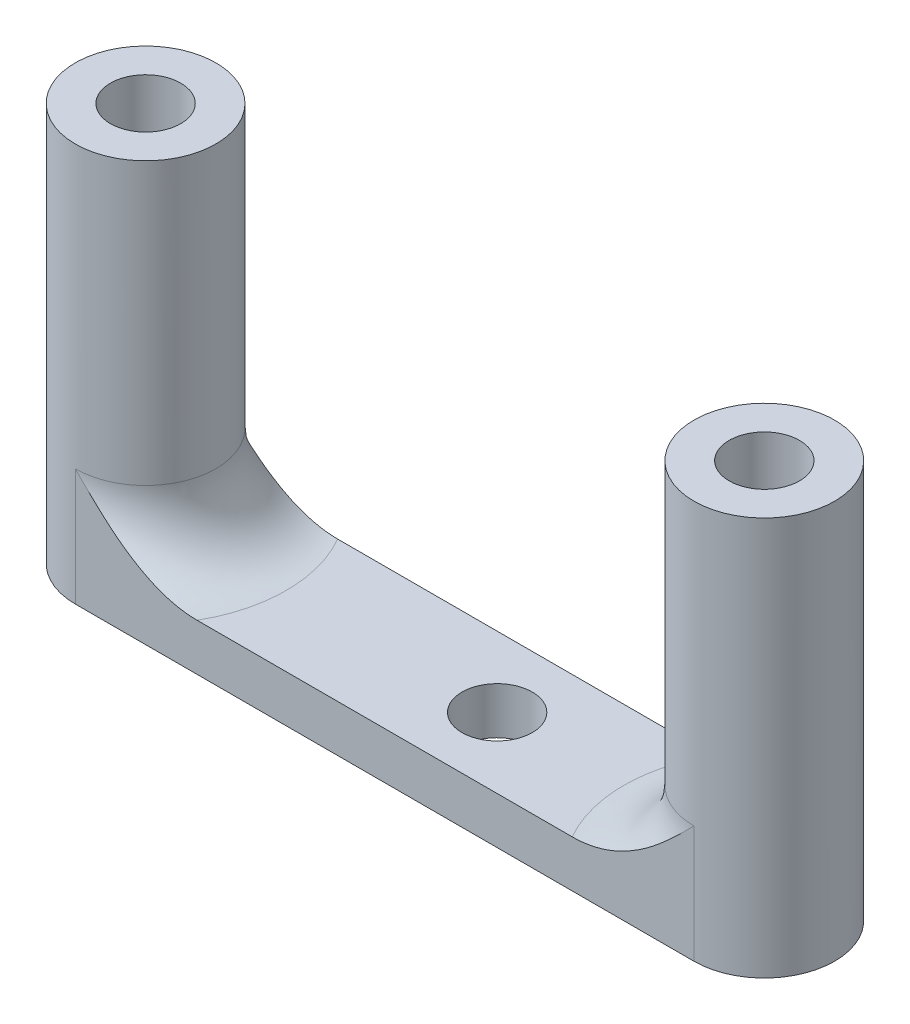
ISO-10303-21;
HEADER;
FILE_DESCRIPTION(('STEP AP214'),'2;1');
FILE_NAME('part.step','',(''),(''),'','','');
FILE_SCHEMA(('AUTOMOTIVE_DESIGN { 1 0 10303 214 1 1 1 1 }'));
ENDSEC;
DATA;
#1=APPLICATION_CONTEXT('core data for automotive mechanical design processes');
#2=APPLICATION_PROTOCOL_DEFINITION('international standard','automotive_design',2000,#1);
#3=PRODUCT_CONTEXT('',#1,'mechanical');
#4=PRODUCT('Part','Part','',(#3));
#5=PRODUCT_RELATED_PRODUCT_CATEGORY('part','',(#4));
#6=PRODUCT_DEFINITION_FORMATION('','',#4);
#7=PRODUCT_DEFINITION_CONTEXT('part definition',#1,'design');
#8=PRODUCT_DEFINITION('design','',#6,#7);
#9=PRODUCT_DEFINITION_SHAPE('','',#8);
#10=(LENGTH_UNIT() NAMED_UNIT(*) SI_UNIT(.MILLI.,.METRE.));
#11=(NAMED_UNIT(*) PLANE_ANGLE_UNIT() SI_UNIT($,.RADIAN.));
#12=(NAMED_UNIT(*) SI_UNIT($,.STERADIAN.) SOLID_ANGLE_UNIT());
#13=UNCERTAINTY_MEASURE_WITH_UNIT(LENGTH_MEASURE(1.E-05),#10,'distance_accuracy_value','');
#14=(GEOMETRIC_REPRESENTATION_CONTEXT(3) GLOBAL_UNCERTAINTY_ASSIGNED_CONTEXT((#13)) GLOBAL_UNIT_ASSIGNED_CONTEXT((#10,
#11,#12)) REPRESENTATION_CONTEXT('',''));
#15=CARTESIAN_POINT('',(0.,0.,0.));
#16=DIRECTION('',(0.,0.,1.));
#17=DIRECTION('',(1.,0.,0.));
#18=AXIS2_PLACEMENT_3D('',#15,#16,#17);
#19=CARTESIAN_POINT('',(0.,2.,0.));
#20=DIRECTION('',(0.,1.,0.));
#21=DIRECTION('',(0.,0.,1.));
#22=AXIS2_PLACEMENT_3D('',#19,#20,#21);
#23=PLANE('',#22);
#24=CARTESIAN_POINT('',(15.,2.,0.));
#25=DIRECTION('',(0.,1.,0.));
#26=DIRECTION('',(0.,0.,1.));
#27=AXIS2_PLACEMENT_3D('',#24,#25,#26);
#28=CIRCLE('',#27,1.5);
#29=CARTESIAN_POINT('',(15.,2.,1.5));
#30=VERTEX_POINT('',#29);
#31=EDGE_CURVE('E138',#30,#30,#28,.T.);
#32=ORIENTED_EDGE('',*,*,#31,.F.);
#33=EDGE_LOOP('',(#32));
#34=FACE_BOUND('',#33,.T.);
#35=DIRECTION('',(1.,0.,0.));
#36=VECTOR('',#35,1.);
#37=CARTESIAN_POINT('',(0.,2.,3.));
#38=LINE('',#37,#36);
#39=CARTESIAN_POINT('',(5.19615242270663,2.,3.));
#40=VERTEX_POINT('',#39);
#41=CARTESIAN_POINT('',(21.2038475772934,2.,3.));
#42=VERTEX_POINT('',#41);
#43=EDGE_CURVE('E193',#40,#42,#38,.T.);
#44=ORIENTED_EDGE('',*,*,#43,.T.);
#45=CARTESIAN_POINT('',(26.4,2.,0.));
#46=DIRECTION('',(0.,1.,0.));
#47=DIRECTION('',(0.,0.,1.));
#48=AXIS2_PLACEMENT_3D('',#45,#46,#47);
#49=CIRCLE('',#48,6.);
#50=CARTESIAN_POINT('',(21.2038475772934,2.,-3.));
#51=VERTEX_POINT('',#50);
#52=EDGE_CURVE('E148',#42,#51,#49,.F.);
#53=ORIENTED_EDGE('',*,*,#52,.T.);
#54=DIRECTION('',(1.,0.,0.));
#55=VECTOR('',#54,1.);
#56=CARTESIAN_POINT('',(0.,2.,-3.));
#57=LINE('',#56,#55);
#58=CARTESIAN_POINT('',(5.19615242270663,2.,-3.));
#59=VERTEX_POINT('',#58);
#60=EDGE_CURVE('E141',#59,#51,#57,.T.);
#61=ORIENTED_EDGE('',*,*,#60,.F.);
#62=CARTESIAN_POINT('',(0.,2.,0.));
#63=DIRECTION('',(0.,1.,0.));
#64=DIRECTION('',(0.,0.,1.));
#65=AXIS2_PLACEMENT_3D('',#62,#63,#64);
#66=CIRCLE('',#65,6.);
#67=EDGE_CURVE('E120',#59,#40,#66,.F.);
#68=ORIENTED_EDGE('',*,*,#67,.T.);
#69=EDGE_LOOP('',(#44,#53,#61,#68));
#70=FACE_BOUND('',#69,.T.);
#71=ADVANCED_FACE('F40',(#34,#70),#23,.T.);
#72=CARTESIAN_POINT('',(0.,2.,3.));
#73=DIRECTION('',(0.,0.,-1.));
#74=DIRECTION('',(-1.,0.,0.));
#75=AXIS2_PLACEMENT_3D('',#72,#73,#74);
#76=PLANE('',#75);
#77=DIRECTION('',(1.,0.,0.));
#78=VECTOR('',#77,1.);
#79=CARTESIAN_POINT('',(0.,0.,3.));
#80=LINE('',#79,#78);
#81=CARTESIAN_POINT('',(0.,0.,3.));
#82=VERTEX_POINT('',#81);
#83=CARTESIAN_POINT('',(26.4,0.,3.));
#84=VERTEX_POINT('',#83);
#85=EDGE_CURVE('E106',#82,#84,#80,.T.);
#86=ORIENTED_EDGE('',*,*,#85,.T.);
#87=DIRECTION('',(0.,-1.,0.));
#88=VECTOR('',#87,1.);
#89=CARTESIAN_POINT('',(26.4,2.,3.));
#90=LINE('',#89,#88);
#91=CARTESIAN_POINT('',(26.4,5.,3.));
#92=VERTEX_POINT('',#91);
#93=EDGE_CURVE('E112',#92,#84,#90,.T.);
#94=ORIENTED_EDGE('',*,*,#93,.F.);
#95=CARTESIAN_POINT('',(21.2038475772934,2.,3.));
#96=CARTESIAN_POINT('',(21.3323905402401,1.99998218210298,3.));
#97=CARTESIAN_POINT('',(21.4608584367806,2.00619338983788,3.));
#98=CARTESIAN_POINT('',(21.7165185660793,2.03022062258355,3.));
#99=CARTESIAN_POINT('',(21.8437124415279,2.04801898743739,3.));
#100=CARTESIAN_POINT('',(22.0945753557731,2.09409313995617,3.));
#101=CARTESIAN_POINT('',(22.2182683985294,2.12224012477032,3.));
#102=CARTESIAN_POINT('',(22.4631017314671,2.18815840703016,3.));
#103=CARTESIAN_POINT('',(22.5842407722222,2.22593430187453,3.));
#104=CARTESIAN_POINT('',(22.8679415812324,2.32588423317901,3.));
#105=CARTESIAN_POINT('',(23.0291515588678,2.39190700124902,3.));
#106=CARTESIAN_POINT('',(23.3450406847037,2.53801190440803,3.));
#107=CARTESIAN_POINT('',(23.4997178359521,2.61809830042489,3.));
#108=CARTESIAN_POINT('',(23.803053314862,2.79045446430362,3.));
#109=CARTESIAN_POINT('',(23.9516793768285,2.88278058033993,3.));
#110=CARTESIAN_POINT('',(24.242452962768,3.07718753602969,3.));
#111=CARTESIAN_POINT('',(24.384597481119,3.17927283461535,3.));
#112=CARTESIAN_POINT('',(24.8597710470216,3.54097570405611,3.));
#113=CARTESIAN_POINT('',(25.1784881477469,3.81922286040245,3.));
#114=CARTESIAN_POINT('',(25.7955632435218,4.39571188094858,3.));
#115=CARTESIAN_POINT('',(26.0939368225871,4.69393808507017,2.99999999999998));
#116=CARTESIAN_POINT('',(26.3948360200621,4.994836021821,3.));
#117=CARTESIAN_POINT('',(26.3974180089046,4.99741801079189,3.));
#118=CARTESIAN_POINT('',(26.4,5.,3.));
#119=B_SPLINE_CURVE_WITH_KNOTS('',3,(#95,#96,#97,#98,#99,#100,#101,#102,#103,#104,#105,#106,
#107,#108,#109,#110,#111,#112,#113,#114,#115,#116,#117,#118),.UNSPECIFIED.,.F.,.F.,(4,2,2,2,2,2,
2,2,2,2,2,4),(0.,0.385368958218872,0.770151940642411,1.15029950394383,1.53062891278464,
2.05242008909191,2.57436962870345,3.09881141308673,3.62349396860826,4.89012609564403,
6.15577676525226,6.16673121643429),.UNSPECIFIED.);
#120=EDGE_CURVE('E166',#92,#42,#119,.F.);
#121=ORIENTED_EDGE('',*,*,#120,.T.);
#122=ORIENTED_EDGE('',*,*,#43,.F.);
#123=CARTESIAN_POINT('',(5.19615242270663,2.,3.));
#124=CARTESIAN_POINT('',(5.06760945976004,1.99998218210298,3.));
#125=CARTESIAN_POINT('',(4.93914156321971,2.00619338983787,3.));
#126=CARTESIAN_POINT('',(4.68348143392134,2.03022062258348,3.));
#127=CARTESIAN_POINT('',(4.55628755847284,2.04801898743727,3.));
#128=CARTESIAN_POINT('',(4.30542464422772,2.094093139956,3.));
#129=CARTESIAN_POINT('',(4.18173160147121,2.12224012477016,3.));
#130=CARTESIAN_POINT('',(3.93689826853325,2.18815840703006,3.));
#131=CARTESIAN_POINT('',(3.81575922777798,2.22593430187448,3.));
#132=CARTESIAN_POINT('',(3.53205841876747,2.32588423317906,3.));
#133=CARTESIAN_POINT('',(3.3708484411319,2.39190700124911,3.));
#134=CARTESIAN_POINT('',(3.0549593152958,2.53801190440826,3.));
#135=CARTESIAN_POINT('',(2.90028216404738,2.6180983004252,3.));
#136=CARTESIAN_POINT('',(2.59694668513745,2.79045446430392,3.));
#137=CARTESIAN_POINT('',(2.44832062317112,2.88278058034013,3.));
#138=CARTESIAN_POINT('',(2.15754703723191,3.07718753602986,3.));
#139=CARTESIAN_POINT('',(2.01540251888108,3.17927283461558,3.));
#140=CARTESIAN_POINT('',(1.54022895297817,3.54097570405566,3.));
#141=CARTESIAN_POINT('',(1.22151185225098,3.81922286039994,3.));
#142=CARTESIAN_POINT('',(0.60443675648067,4.39571188095075,3.));
#143=CARTESIAN_POINT('',(0.306063177421879,4.69393808507906,3.));
#144=CARTESIAN_POINT('',(0.00516397993798114,4.99483602182119,3.));
#145=CARTESIAN_POINT('',(0.00258199109543038,4.99741801079198,3.));
#146=CARTESIAN_POINT('',(0.,5.,3.));
#147=B_SPLINE_CURVE_WITH_KNOTS('',3,(#123,#124,#125,#126,#127,#128,#129,#130,#131,#132,#133,
#134,#135,#136,#137,#138,#139,#140,#141,#142,#143,#144,#145,#146),.UNSPECIFIED.,.F.,.F.,(4,2,2,
2,2,2,2,2,2,2,2,4),(0.,0.385368958218407,0.770151940641463,1.15029950394335,1.53062891278463,
2.0524200890923,2.5743696287042,3.09881141308705,3.62349396860826,4.89012609564365,
6.15577676525232,6.16673121643428),.UNSPECIFIED.);
#148=CARTESIAN_POINT('',(0.,5.,3.));
#149=VERTEX_POINT('',#148);
#150=EDGE_CURVE('E11',#40,#149,#147,.T.);
#151=ORIENTED_EDGE('',*,*,#150,.T.);
#152=DIRECTION('',(0.,-1.,0.));
#153=VECTOR('',#152,1.);
#154=CARTESIAN_POINT('',(0.,2.,3.));
#155=LINE('',#154,#153);
#156=EDGE_CURVE('E70',#149,#82,#155,.T.);
#157=ORIENTED_EDGE('',*,*,#156,.T.);
#158=EDGE_LOOP('',(#86,#94,#121,#122,#151,#157));
#159=FACE_BOUND('',#158,.T.);
#160=ADVANCED_FACE('F123',(#159),#76,.F.);
#161=CARTESIAN_POINT('',(26.4,2.,0.));
#162=DIRECTION('',(0.,-1.,0.));
#163=DIRECTION('',(0.,0.,-1.));
#164=AXIS2_PLACEMENT_3D('',#161,#162,#163);
#165=CYLINDRICAL_SURFACE('',#164,3.);
#166=DIRECTION('',(0.,-1.,0.));
#167=VECTOR('',#166,1.);
#168=CARTESIAN_POINT('',(26.4,2.,-3.));
#169=LINE('',#168,#167);
#170=CARTESIAN_POINT('',(26.4,5.,-3.));
#171=VERTEX_POINT('',#170);
#172=CARTESIAN_POINT('',(26.4,0.,-3.));
#173=VERTEX_POINT('',#172);
#174=EDGE_CURVE('E121',#171,#173,#169,.T.);
#175=ORIENTED_EDGE('',*,*,#174,.F.);
#176=CARTESIAN_POINT('',(26.4,5.,0.));
#177=DIRECTION('',(0.,1.,0.));
#178=DIRECTION('',(0.,0.,1.));
#179=AXIS2_PLACEMENT_3D('',#176,#177,#178);
#180=CIRCLE('',#179,3.);
#181=EDGE_CURVE('E116',#171,#92,#180,.T.);
#182=ORIENTED_EDGE('',*,*,#181,.T.);
#183=ORIENTED_EDGE('',*,*,#93,.T.);
#184=CARTESIAN_POINT('',(26.4,0.,0.));
#185=DIRECTION('',(0.,1.,0.));
#186=DIRECTION('',(0.,0.,1.));
#187=AXIS2_PLACEMENT_3D('',#184,#185,#186);
#188=CIRCLE('',#187,3.);
#189=EDGE_CURVE('E101',#84,#173,#188,.T.);
#190=ORIENTED_EDGE('',*,*,#189,.T.);
#191=EDGE_LOOP('',(#175,#182,#183,#190));
#192=FACE_BOUND('',#191,.T.);
#193=CARTESIAN_POINT('',(26.4,17.,0.));
#194=DIRECTION('',(0.,1.,0.));
#195=DIRECTION('',(0.,0.,1.));
#196=AXIS2_PLACEMENT_3D('',#193,#194,#195);
#197=CIRCLE('',#196,3.);
#198=CARTESIAN_POINT('',(26.4,17.,3.));
#199=VERTEX_POINT('',#198);
#200=EDGE_CURVE('E253',#199,#199,#197,.T.);
#201=ORIENTED_EDGE('',*,*,#200,.F.);
#202=EDGE_LOOP('',(#201));
#203=FACE_BOUND('',#202,.T.);
#204=ADVANCED_FACE('F113',(#192,#203),#165,.T.);
#205=CARTESIAN_POINT('',(0.,2.,-3.));
#206=DIRECTION('',(0.,0.,-1.));
#207=DIRECTION('',(-1.,0.,0.));
#208=AXIS2_PLACEMENT_3D('',#205,#206,#207);
#209=PLANE('',#208);
#210=DIRECTION('',(1.,0.,0.));
#211=VECTOR('',#210,1.);
#212=CARTESIAN_POINT('',(0.,0.,-3.));
#213=LINE('',#212,#211);
#214=CARTESIAN_POINT('',(0.,0.,-3.));
#215=VERTEX_POINT('',#214);
#216=EDGE_CURVE('E107',#215,#173,#213,.T.);
#217=ORIENTED_EDGE('',*,*,#216,.F.);
#218=DIRECTION('',(0.,-1.,0.));
#219=VECTOR('',#218,1.);
#220=CARTESIAN_POINT('',(0.,2.,-3.));
#221=LINE('',#220,#219);
#222=CARTESIAN_POINT('',(0.,5.,-3.));
#223=VERTEX_POINT('',#222);
#224=EDGE_CURVE('E62',#223,#215,#221,.T.);
#225=ORIENTED_EDGE('',*,*,#224,.F.);
#226=CARTESIAN_POINT('',(5.19615242270663,2.,-3.));
#227=CARTESIAN_POINT('',(5.06760945976004,1.99998218210298,-3.));
#228=CARTESIAN_POINT('',(4.93914156321971,2.00619338983787,-3.));
#229=CARTESIAN_POINT('',(4.68348143392133,2.03022062258348,-3.));
#230=CARTESIAN_POINT('',(4.55628755847283,2.04801898743727,-3.));
#231=CARTESIAN_POINT('',(4.30542464422772,2.094093139956,-3.));
#232=CARTESIAN_POINT('',(4.18173160147121,2.12224012477017,-3.));
#233=CARTESIAN_POINT('',(3.93689826853324,2.18815840703006,-3.));
#234=CARTESIAN_POINT('',(3.81575922777798,2.22593430187448,-3.));
#235=CARTESIAN_POINT('',(3.53205841876747,2.32588423317906,-3.));
#236=CARTESIAN_POINT('',(3.3708484411319,2.39190700124911,-3.));
#237=CARTESIAN_POINT('',(3.0549593152958,2.53801190440826,-3.));
#238=CARTESIAN_POINT('',(2.90028216404738,2.61809830042519,-3.));
#239=CARTESIAN_POINT('',(2.59694668513745,2.79045446430392,-3.));
#240=CARTESIAN_POINT('',(2.44832062317112,2.88278058034013,-3.));
#241=CARTESIAN_POINT('',(2.15754703723191,3.07718753602985,-3.));
#242=CARTESIAN_POINT('',(2.01540251888108,3.17927283461557,-3.));
#243=CARTESIAN_POINT('',(1.54022895297817,3.54097570405566,-3.));
#244=CARTESIAN_POINT('',(1.22151185225099,3.81922286039996,-3.));
#245=CARTESIAN_POINT('',(0.604436756480659,4.39571188095074,-3.));
#246=CARTESIAN_POINT('',(0.30606317742184,4.69393808507902,-3.));
#247=CARTESIAN_POINT('',(0.00516397993798033,4.99483602182119,-3.));
#248=CARTESIAN_POINT('',(0.00258199109542995,4.99741801079198,-3.));
#249=CARTESIAN_POINT('',(0.,5.,-3.));
#250=B_SPLINE_CURVE_WITH_KNOTS('',3,(#226,#227,#228,#229,#230,#231,#232,#233,#234,#235,#236,
#237,#238,#239,#240,#241,#242,#243,#244,#245,#246,#247,#248,#249),.UNSPECIFIED.,.F.,.F.,(4,2,2,
2,2,2,2,2,2,2,2,4),(0.,0.38536895821841,0.770151940641468,1.15029950394335,1.53062891278463,
2.0524200890923,2.5743696287042,3.09881141308705,3.62349396860826,4.89012609564365,
6.15577676525232,6.16673121643429),.UNSPECIFIED.);
#251=EDGE_CURVE('E55',#223,#59,#250,.F.);
#252=ORIENTED_EDGE('',*,*,#251,.T.);
#253=ORIENTED_EDGE('',*,*,#60,.T.);
#254=CARTESIAN_POINT('',(21.2038475772934,2.,-3.));
#255=CARTESIAN_POINT('',(21.3323905402399,1.99998218210298,-3.));
#256=CARTESIAN_POINT('',(21.4608584367803,2.00619338983786,-3.));
#257=CARTESIAN_POINT('',(21.7165185660786,2.03022062258347,-3.));
#258=CARTESIAN_POINT('',(21.8437124415271,2.04801898743726,-3.));
#259=CARTESIAN_POINT('',(22.0945753557722,2.09409313995598,-3.));
#260=CARTESIAN_POINT('',(22.2182683985287,2.12224012477015,-3.));
#261=CARTESIAN_POINT('',(22.4631017314667,2.18815840703005,-3.));
#262=CARTESIAN_POINT('',(22.584240772222,2.22593430187447,-3.));
#263=CARTESIAN_POINT('',(22.8679415812325,2.32588423317906,-3.));
#264=CARTESIAN_POINT('',(23.0291515588681,2.39190700124912,-3.));
#265=CARTESIAN_POINT('',(23.3450406847042,2.53801190440828,-3.));
#266=CARTESIAN_POINT('',(23.4997178359527,2.61809830042523,-3.));
#267=CARTESIAN_POINT('',(23.8030533148626,2.79045446430395,-3.));
#268=CARTESIAN_POINT('',(23.9516793768289,2.88278058034016,-3.));
#269=CARTESIAN_POINT('',(24.2424529627681,3.07718753602987,-3.));
#270=CARTESIAN_POINT('',(24.3845974811189,3.1792728346156,-3.));
#271=CARTESIAN_POINT('',(24.8597710470219,3.54097570405561,-3.));
#272=CARTESIAN_POINT('',(25.1784881477492,3.8192228603997,-3.));
#273=CARTESIAN_POINT('',(25.7955632435191,4.39571188095096,-3.));
#274=CARTESIAN_POINT('',(26.0939368225772,4.69393808507993,-3.));
#275=CARTESIAN_POINT('',(26.394836020062,4.9948360218212,-3.));
#276=CARTESIAN_POINT('',(26.3974180089046,4.99741801079199,-3.));
#277=CARTESIAN_POINT('',(26.4,5.,-3.));
#278=B_SPLINE_CURVE_WITH_KNOTS('',3,(#254,#255,#256,#257,#258,#259,#260,#261,#262,#263,#264,
#265,#266,#267,#268,#269,#270,#271,#272,#273,#274,#275,#276,#277),.UNSPECIFIED.,.F.,.F.,(4,2,2,
2,2,2,2,2,2,2,2,4),(0.,0.385368958218363,0.770151940641371,1.1502995039433,1.53062891278464,
2.05242008909234,2.57436962870428,3.09881141308708,3.62349396860825,4.89012609564361,
6.15577676525232,6.16673121643428),.UNSPECIFIED.);
#279=EDGE_CURVE('E157',#51,#171,#278,.T.);
#280=ORIENTED_EDGE('',*,*,#279,.T.);
#281=ORIENTED_EDGE('',*,*,#174,.T.);
#282=EDGE_LOOP('',(#217,#225,#252,#253,#280,#281));
#283=FACE_BOUND('',#282,.T.);
#284=ADVANCED_FACE('F174',(#283),#209,.T.);
#285=CARTESIAN_POINT('',(0.,2.,0.));
#286=DIRECTION('',(0.,-1.,0.));
#287=DIRECTION('',(0.,0.,-1.));
#288=AXIS2_PLACEMENT_3D('',#285,#286,#287);
#289=CYLINDRICAL_SURFACE('',#288,1.5);
#290=CARTESIAN_POINT('',(0.,0.,0.));
#291=DIRECTION('',(0.,1.,0.));
#292=DIRECTION('',(0.,0.,1.));
#293=AXIS2_PLACEMENT_3D('',#290,#291,#292);
#294=CIRCLE('',#293,1.5);
#295=CARTESIAN_POINT('',(0.,0.,1.5));
#296=VERTEX_POINT('',#295);
#297=EDGE_CURVE('E125',#296,#296,#294,.T.);
#298=ORIENTED_EDGE('',*,*,#297,.F.);
#299=EDGE_LOOP('',(#298));
#300=FACE_BOUND('',#299,.T.);
#301=CARTESIAN_POINT('',(0.,17.,0.));
#302=DIRECTION('',(0.,1.,0.));
#303=DIRECTION('',(0.,0.,1.));
#304=AXIS2_PLACEMENT_3D('',#301,#302,#303);
#305=CIRCLE('',#304,1.5);
#306=CARTESIAN_POINT('',(0.,17.,1.5));
#307=VERTEX_POINT('',#306);
#308=EDGE_CURVE('E257',#307,#307,#305,.T.);
#309=ORIENTED_EDGE('',*,*,#308,.T.);
#310=EDGE_LOOP('',(#309));
#311=FACE_BOUND('',#310,.T.);
#312=ADVANCED_FACE('F179',(#300,#311),#289,.F.);
#313=CARTESIAN_POINT('',(15.,2.,0.));
#314=DIRECTION('',(0.,-1.,0.));
#315=DIRECTION('',(0.,0.,-1.));
#316=AXIS2_PLACEMENT_3D('',#313,#314,#315);
#317=CYLINDRICAL_SURFACE('',#316,1.5);
#318=ORIENTED_EDGE('',*,*,#31,.T.);
#319=EDGE_LOOP('',(#318));
#320=FACE_BOUND('',#319,.T.);
#321=CARTESIAN_POINT('',(15.,0.,0.));
#322=DIRECTION('',(0.,1.,0.));
#323=DIRECTION('',(0.,0.,1.));
#324=AXIS2_PLACEMENT_3D('',#321,#322,#323);
#325=CIRCLE('',#324,1.5);
#326=CARTESIAN_POINT('',(15.,0.,1.5));
#327=VERTEX_POINT('',#326);
#328=EDGE_CURVE('E129',#327,#327,#325,.T.);
#329=ORIENTED_EDGE('',*,*,#328,.F.);
#330=EDGE_LOOP('',(#329));
#331=FACE_BOUND('',#330,.T.);
#332=ADVANCED_FACE('F215',(#320,#331),#317,.F.);
#333=CARTESIAN_POINT('',(26.4,2.,0.));
#334=DIRECTION('',(0.,-1.,0.));
#335=DIRECTION('',(0.,0.,-1.));
#336=AXIS2_PLACEMENT_3D('',#333,#334,#335);
#337=CYLINDRICAL_SURFACE('',#336,1.5);
#338=CARTESIAN_POINT('',(26.4,0.,0.));
#339=DIRECTION('',(0.,1.,0.));
#340=DIRECTION('',(0.,0.,1.));
#341=AXIS2_PLACEMENT_3D('',#338,#339,#340);
#342=CIRCLE('',#341,1.5);
#343=CARTESIAN_POINT('',(26.4,0.,1.5));
#344=VERTEX_POINT('',#343);
#345=EDGE_CURVE('E205',#344,#344,#342,.T.);
#346=ORIENTED_EDGE('',*,*,#345,.F.);
#347=EDGE_LOOP('',(#346));
#348=FACE_BOUND('',#347,.T.);
#349=CARTESIAN_POINT('',(26.4,17.,0.));
#350=DIRECTION('',(0.,1.,0.));
#351=DIRECTION('',(0.,0.,1.));
#352=AXIS2_PLACEMENT_3D('',#349,#350,#351);
#353=CIRCLE('',#352,1.5);
#354=CARTESIAN_POINT('',(26.4,17.,1.5));
#355=VERTEX_POINT('',#354);
#356=EDGE_CURVE('E250',#355,#355,#353,.T.);
#357=ORIENTED_EDGE('',*,*,#356,.T.);
#358=EDGE_LOOP('',(#357));
#359=FACE_BOUND('',#358,.T.);
#360=ADVANCED_FACE('F217',(#348,#359),#337,.F.);
#361=CARTESIAN_POINT('',(0.,2.,0.));
#362=DIRECTION('',(0.,-1.,0.));
#363=DIRECTION('',(0.,0.,-1.));
#364=AXIS2_PLACEMENT_3D('',#361,#362,#363);
#365=CYLINDRICAL_SURFACE('',#364,3.);
#366=CARTESIAN_POINT('',(0.,5.,0.));
#367=DIRECTION('',(0.,1.,0.));
#368=DIRECTION('',(0.,0.,1.));
#369=AXIS2_PLACEMENT_3D('',#366,#367,#368);
#370=CIRCLE('',#369,3.);
#371=EDGE_CURVE('E154',#149,#223,#370,.T.);
#372=ORIENTED_EDGE('',*,*,#371,.T.);
#373=ORIENTED_EDGE('',*,*,#224,.T.);
#374=CARTESIAN_POINT('',(0.,0.,0.));
#375=DIRECTION('',(0.,1.,0.));
#376=DIRECTION('',(0.,0.,1.));
#377=AXIS2_PLACEMENT_3D('',#374,#375,#376);
#378=CIRCLE('',#377,3.);
#379=EDGE_CURVE('E135',#215,#82,#378,.T.);
#380=ORIENTED_EDGE('',*,*,#379,.T.);
#381=ORIENTED_EDGE('',*,*,#156,.F.);
#382=EDGE_LOOP('',(#372,#373,#380,#381));
#383=FACE_BOUND('',#382,.T.);
#384=CARTESIAN_POINT('',(0.,17.,0.));
#385=DIRECTION('',(0.,1.,0.));
#386=DIRECTION('',(0.,0.,1.));
#387=AXIS2_PLACEMENT_3D('',#384,#385,#386);
#388=CIRCLE('',#387,3.);
#389=CARTESIAN_POINT('',(0.,17.,3.));
#390=VERTEX_POINT('',#389);
#391=EDGE_CURVE('E208',#390,#390,#388,.T.);
#392=ORIENTED_EDGE('',*,*,#391,.F.);
#393=EDGE_LOOP('',(#392));
#394=FACE_BOUND('',#393,.T.);
#395=ADVANCED_FACE('F180',(#383,#394),#365,.T.);
#396=CARTESIAN_POINT('',(0.,0.,0.));
#397=DIRECTION('',(0.,1.,0.));
#398=DIRECTION('',(0.,0.,1.));
#399=AXIS2_PLACEMENT_3D('',#396,#397,#398);
#400=PLANE('',#399);
#401=ORIENTED_EDGE('',*,*,#345,.T.);
#402=EDGE_LOOP('',(#401));
#403=FACE_BOUND('',#402,.T.);
#404=ORIENTED_EDGE('',*,*,#328,.T.);
#405=EDGE_LOOP('',(#404));
#406=FACE_BOUND('',#405,.T.);
#407=ORIENTED_EDGE('',*,*,#297,.T.);
#408=EDGE_LOOP('',(#407));
#409=FACE_BOUND('',#408,.T.);
#410=ORIENTED_EDGE('',*,*,#85,.F.);
#411=ORIENTED_EDGE('',*,*,#379,.F.);
#412=ORIENTED_EDGE('',*,*,#216,.T.);
#413=ORIENTED_EDGE('',*,*,#189,.F.);
#414=EDGE_LOOP('',(#410,#411,#412,#413));
#415=FACE_BOUND('',#414,.T.);
#416=ADVANCED_FACE('F103',(#403,#406,#409,#415),#400,.F.);
#417=CARTESIAN_POINT('',(0.,17.,0.));
#418=DIRECTION('',(0.,1.,0.));
#419=DIRECTION('',(0.,0.,1.));
#420=AXIS2_PLACEMENT_3D('',#417,#418,#419);
#421=PLANE('',#420);
#422=ORIENTED_EDGE('',*,*,#391,.T.);
#423=EDGE_LOOP('',(#422));
#424=FACE_BOUND('',#423,.T.);
#425=ORIENTED_EDGE('',*,*,#308,.F.);
#426=EDGE_LOOP('',(#425));
#427=FACE_BOUND('',#426,.T.);
#428=ADVANCED_FACE('F236',(#424,#427),#421,.T.);
#429=CARTESIAN_POINT('',(26.4,17.,0.));
#430=DIRECTION('',(0.,1.,0.));
#431=DIRECTION('',(0.,0.,1.));
#432=AXIS2_PLACEMENT_3D('',#429,#430,#431);
#433=PLANE('',#432);
#434=ORIENTED_EDGE('',*,*,#200,.T.);
#435=EDGE_LOOP('',(#434));
#436=FACE_BOUND('',#435,.T.);
#437=ORIENTED_EDGE('',*,*,#356,.F.);
#438=EDGE_LOOP('',(#437));
#439=FACE_BOUND('',#438,.T.);
#440=ADVANCED_FACE('F244',(#436,#439),#433,.T.);
#441=CARTESIAN_POINT('',(26.4,5.,0.));
#442=DIRECTION('',(0.,1.,0.));
#443=DIRECTION('',(0.,0.,1.));
#444=AXIS2_PLACEMENT_3D('',#441,#442,#443);
#445=TOROIDAL_SURFACE('',#444,6.,3.);
#446=ORIENTED_EDGE('',*,*,#120,.F.);
#447=ORIENTED_EDGE('',*,*,#181,.F.);
#448=ORIENTED_EDGE('',*,*,#279,.F.);
#449=ORIENTED_EDGE('',*,*,#52,.F.);
#450=EDGE_LOOP('',(#446,#447,#448,#449));
#451=FACE_BOUND('',#450,.T.);
#452=ADVANCED_FACE('F171',(#451),#445,.F.);
#453=CARTESIAN_POINT('',(0.,5.,0.));
#454=DIRECTION('',(0.,1.,0.));
#455=DIRECTION('',(0.,0.,1.));
#456=AXIS2_PLACEMENT_3D('',#453,#454,#455);
#457=TOROIDAL_SURFACE('',#456,6.,3.);
#458=ORIENTED_EDGE('',*,*,#150,.F.);
#459=ORIENTED_EDGE('',*,*,#67,.F.);
#460=ORIENTED_EDGE('',*,*,#251,.F.);
#461=ORIENTED_EDGE('',*,*,#371,.F.);
#462=EDGE_LOOP('',(#458,#459,#460,#461));
#463=FACE_BOUND('',#462,.T.);
#464=ADVANCED_FACE('F42',(#463),#457,.F.);
#465=CLOSED_SHELL('',(#71,#160,#204,#284,#312,#332,#360,#395,#416,#428,#440,#452,#464));
#466=MANIFOLD_SOLID_BREP('B2',#465);
#467=ADVANCED_BREP_SHAPE_REPRESENTATION('',(#18,#466),#14);
#468=SHAPE_DEFINITION_REPRESENTATION(#9,#467);
ENDSEC;
END-ISO-10303-21;
